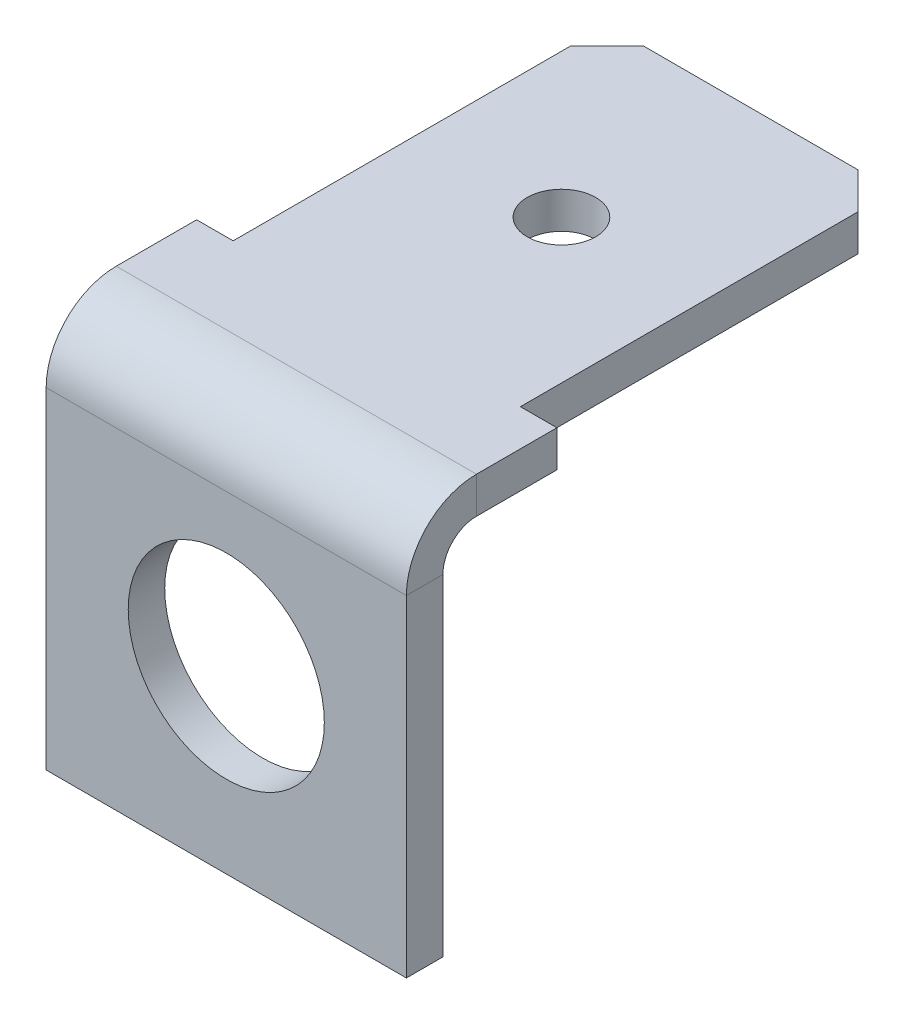
ISO-10303-21;
HEADER;
FILE_DESCRIPTION(('STEP AP214'),'2;1');
FILE_NAME('part.step','',(''),(''),'','','');
FILE_SCHEMA(('AUTOMOTIVE_DESIGN { 1 0 10303 214 1 1 1 1 }'));
ENDSEC;
DATA;
#1=APPLICATION_CONTEXT('core data for automotive mechanical design processes');
#2=APPLICATION_PROTOCOL_DEFINITION('international standard','automotive_design',2000,#1);
#3=PRODUCT_CONTEXT('',#1,'mechanical');
#4=PRODUCT('Part','Part','',(#3));
#5=PRODUCT_RELATED_PRODUCT_CATEGORY('part','',(#4));
#6=PRODUCT_DEFINITION_FORMATION('','',#4);
#7=PRODUCT_DEFINITION_CONTEXT('part definition',#1,'design');
#8=PRODUCT_DEFINITION('design','',#6,#7);
#9=PRODUCT_DEFINITION_SHAPE('','',#8);
#10=(LENGTH_UNIT() NAMED_UNIT(*) SI_UNIT(.MILLI.,.METRE.));
#11=(NAMED_UNIT(*) PLANE_ANGLE_UNIT() SI_UNIT($,.RADIAN.));
#12=(NAMED_UNIT(*) SI_UNIT($,.STERADIAN.) SOLID_ANGLE_UNIT());
#13=UNCERTAINTY_MEASURE_WITH_UNIT(LENGTH_MEASURE(1.E-05),#10,'distance_accuracy_value','');
#14=(GEOMETRIC_REPRESENTATION_CONTEXT(3) GLOBAL_UNCERTAINTY_ASSIGNED_CONTEXT((#13)) GLOBAL_UNIT_ASSIGNED_CONTEXT((#10,
#11,#12)) REPRESENTATION_CONTEXT('',''));
#15=CARTESIAN_POINT('',(0.,0.,0.));
#16=DIRECTION('',(0.,0.,1.));
#17=DIRECTION('',(1.,0.,0.));
#18=AXIS2_PLACEMENT_3D('',#15,#16,#17);
#19=CARTESIAN_POINT('',(3.95,4.4,-0.8));
#20=DIRECTION('',(1.,0.,0.));
#21=DIRECTION('',(0.,1.,0.));
#22=AXIS2_PLACEMENT_3D('',#19,#20,#21);
#23=PLANE('',#22);
#24=DIRECTION('',(0.,1.,0.));
#25=VECTOR('',#24,1.);
#26=CARTESIAN_POINT('',(3.95,4.4,-0.8));
#27=LINE('',#26,#25);
#28=CARTESIAN_POINT('',(3.95,-4.4,-0.8));
#29=VERTEX_POINT('',#28);
#30=CARTESIAN_POINT('',(3.95,2.8634,-0.8));
#31=VERTEX_POINT('',#30);
#32=EDGE_CURVE('E254',#29,#31,#27,.T.);
#33=ORIENTED_EDGE('',*,*,#32,.T.);
#34=DIRECTION('',(0.,0.,1.));
#35=VECTOR('',#34,1.);
#36=CARTESIAN_POINT('',(3.95,2.8634,-0.8));
#37=LINE('',#36,#35);
#38=CARTESIAN_POINT('',(3.95,2.8634,0.));
#39=VERTEX_POINT('',#38);
#40=EDGE_CURVE('E232',#31,#39,#37,.T.);
#41=ORIENTED_EDGE('',*,*,#40,.T.);
#42=DIRECTION('',(0.,1.,0.));
#43=VECTOR('',#42,1.);
#44=CARTESIAN_POINT('',(3.95,4.4,0.));
#45=LINE('',#44,#43);
#46=CARTESIAN_POINT('',(3.95,-4.4,0.));
#47=VERTEX_POINT('',#46);
#48=EDGE_CURVE('E251',#47,#39,#45,.T.);
#49=ORIENTED_EDGE('',*,*,#48,.F.);
#50=DIRECTION('',(0.,0.,1.));
#51=VECTOR('',#50,1.);
#52=CARTESIAN_POINT('',(3.95,-4.4,-0.8));
#53=LINE('',#52,#51);
#54=EDGE_CURVE('E264',#29,#47,#53,.T.);
#55=ORIENTED_EDGE('',*,*,#54,.F.);
#56=EDGE_LOOP('',(#33,#41,#49,#55));
#57=FACE_BOUND('',#56,.T.);
#58=ADVANCED_FACE('F57',(#57),#23,.T.);
#59=CARTESIAN_POINT('',(0.,0.,-0.8));
#60=DIRECTION('',(0.,0.,1.));
#61=DIRECTION('',(1.,0.,0.));
#62=AXIS2_PLACEMENT_3D('',#59,#60,#61);
#63=PLANE('',#62);
#64=CARTESIAN_POINT('',(0.,-0.45,-0.8));
#65=DIRECTION('',(0.,0.,-1.));
#66=DIRECTION('',(-1.,0.,0.));
#67=AXIS2_PLACEMENT_3D('',#64,#65,#66);
#68=CIRCLE('',#67,2.15);
#69=CARTESIAN_POINT('',(-2.15,-0.45,-0.8));
#70=VERTEX_POINT('',#69);
#71=EDGE_CURVE('E196',#70,#70,#68,.T.);
#72=ORIENTED_EDGE('',*,*,#71,.F.);
#73=EDGE_LOOP('',(#72));
#74=FACE_BOUND('',#73,.T.);
#75=DIRECTION('',(1.,0.,0.));
#76=VECTOR('',#75,1.);
#77=CARTESIAN_POINT('',(3.95,2.8634,-0.8));
#78=LINE('',#77,#76);
#79=CARTESIAN_POINT('',(-3.95,2.8634,-0.8));
#80=VERTEX_POINT('',#79);
#81=EDGE_CURVE('E238',#31,#80,#78,.F.);
#82=ORIENTED_EDGE('',*,*,#81,.F.);
#83=ORIENTED_EDGE('',*,*,#32,.F.);
#84=DIRECTION('',(1.,0.,0.));
#85=VECTOR('',#84,1.);
#86=CARTESIAN_POINT('',(-3.95,-4.4,-0.8));
#87=LINE('',#86,#85);
#88=CARTESIAN_POINT('',(-3.95,-4.4,-0.8));
#89=VERTEX_POINT('',#88);
#90=EDGE_CURVE('E250',#89,#29,#87,.T.);
#91=ORIENTED_EDGE('',*,*,#90,.F.);
#92=DIRECTION('',(0.,-1.,0.));
#93=VECTOR('',#92,1.);
#94=CARTESIAN_POINT('',(-3.95,4.4,-0.8));
#95=LINE('',#94,#93);
#96=EDGE_CURVE('E248',#80,#89,#95,.T.);
#97=ORIENTED_EDGE('',*,*,#96,.F.);
#98=EDGE_LOOP('',(#82,#83,#91,#97));
#99=FACE_BOUND('',#98,.T.);
#100=ADVANCED_FACE('F343',(#74,#99),#63,.F.);
#101=CARTESIAN_POINT('',(0.,0.,0.));
#102=DIRECTION('',(0.,0.,1.));
#103=DIRECTION('',(1.,0.,0.));
#104=AXIS2_PLACEMENT_3D('',#101,#102,#103);
#105=PLANE('',#104);
#106=CARTESIAN_POINT('',(0.,-0.45,0.));
#107=DIRECTION('',(0.,0.,1.));
#108=DIRECTION('',(1.,0.,0.));
#109=AXIS2_PLACEMENT_3D('',#106,#107,#108);
#110=CIRCLE('',#109,2.15);
#111=CARTESIAN_POINT('',(2.15,-0.45,0.));
#112=VERTEX_POINT('',#111);
#113=EDGE_CURVE('E199',#112,#112,#110,.T.);
#114=ORIENTED_EDGE('',*,*,#113,.F.);
#115=EDGE_LOOP('',(#114));
#116=FACE_BOUND('',#115,.T.);
#117=ORIENTED_EDGE('',*,*,#48,.T.);
#118=DIRECTION('',(1.,0.,0.));
#119=VECTOR('',#118,1.);
#120=CARTESIAN_POINT('',(3.95,2.8634,0.));
#121=LINE('',#120,#119);
#122=CARTESIAN_POINT('',(-3.95,2.8634,0.));
#123=VERTEX_POINT('',#122);
#124=EDGE_CURVE('E225',#39,#123,#121,.F.);
#125=ORIENTED_EDGE('',*,*,#124,.T.);
#126=DIRECTION('',(0.,-1.,0.));
#127=VECTOR('',#126,1.);
#128=CARTESIAN_POINT('',(-3.95,4.4,0.));
#129=LINE('',#128,#127);
#130=CARTESIAN_POINT('',(-3.95,-4.4,0.));
#131=VERTEX_POINT('',#130);
#132=EDGE_CURVE('E245',#123,#131,#129,.T.);
#133=ORIENTED_EDGE('',*,*,#132,.T.);
#134=DIRECTION('',(1.,0.,0.));
#135=VECTOR('',#134,1.);
#136=CARTESIAN_POINT('',(-3.95,-4.4,0.));
#137=LINE('',#136,#135);
#138=EDGE_CURVE('E259',#131,#47,#137,.T.);
#139=ORIENTED_EDGE('',*,*,#138,.T.);
#140=EDGE_LOOP('',(#117,#125,#133,#139));
#141=FACE_BOUND('',#140,.T.);
#142=ADVANCED_FACE('F325',(#116,#141),#105,.T.);
#143=CARTESIAN_POINT('',(-3.95,4.4,-0.8));
#144=DIRECTION('',(-1.,0.,0.));
#145=DIRECTION('',(0.,-1.,0.));
#146=AXIS2_PLACEMENT_3D('',#143,#144,#145);
#147=PLANE('',#146);
#148=DIRECTION('',(0.,0.,1.));
#149=VECTOR('',#148,1.);
#150=CARTESIAN_POINT('',(-3.95,2.8634,-0.8));
#151=LINE('',#150,#149);
#152=EDGE_CURVE('E242',#80,#123,#151,.T.);
#153=ORIENTED_EDGE('',*,*,#152,.F.);
#154=ORIENTED_EDGE('',*,*,#96,.T.);
#155=DIRECTION('',(0.,0.,1.));
#156=VECTOR('',#155,1.);
#157=CARTESIAN_POINT('',(-3.95,-4.4,-0.8));
#158=LINE('',#157,#156);
#159=EDGE_CURVE('E257',#89,#131,#158,.T.);
#160=ORIENTED_EDGE('',*,*,#159,.T.);
#161=ORIENTED_EDGE('',*,*,#132,.F.);
#162=EDGE_LOOP('',(#153,#154,#160,#161));
#163=FACE_BOUND('',#162,.T.);
#164=ADVANCED_FACE('F327',(#163),#147,.T.);
#165=CARTESIAN_POINT('',(-3.95,-4.4,-0.8));
#166=DIRECTION('',(0.,-1.,0.));
#167=DIRECTION('',(0.,0.,-1.));
#168=AXIS2_PLACEMENT_3D('',#165,#166,#167);
#169=PLANE('',#168);
#170=ORIENTED_EDGE('',*,*,#138,.F.);
#171=ORIENTED_EDGE('',*,*,#159,.F.);
#172=ORIENTED_EDGE('',*,*,#90,.T.);
#173=ORIENTED_EDGE('',*,*,#54,.T.);
#174=EDGE_LOOP('',(#170,#171,#172,#173));
#175=FACE_BOUND('',#174,.T.);
#176=ADVANCED_FACE('F332',(#175),#169,.T.);
#177=CARTESIAN_POINT('',(-3.95,2.8634,-1.5366));
#178=DIRECTION('',(-1.,0.,0.));
#179=DIRECTION('',(0.,0.,1.));
#180=AXIS2_PLACEMENT_3D('',#177,#178,#179);
#181=PLANE('',#180);
#182=DIRECTION('',(0.,-1.,0.));
#183=VECTOR('',#182,1.);
#184=CARTESIAN_POINT('',(-3.95,4.4,-1.5366));
#185=LINE('',#184,#183);
#186=CARTESIAN_POINT('',(-3.95,3.6,-1.5366));
#187=VERTEX_POINT('',#186);
#188=CARTESIAN_POINT('',(-3.95,4.4,-1.53659999999999));
#189=VERTEX_POINT('',#188);
#190=EDGE_CURVE('E222',#187,#189,#185,.F.);
#191=ORIENTED_EDGE('',*,*,#190,.F.);
#192=CARTESIAN_POINT('',(-3.95,2.8634,-1.5366));
#193=DIRECTION('',(1.,0.,0.));
#194=DIRECTION('',(0.,0.,-1.));
#195=AXIS2_PLACEMENT_3D('',#192,#193,#194);
#196=CIRCLE('',#195,0.7366);
#197=EDGE_CURVE('E235',#80,#187,#196,.F.);
#198=ORIENTED_EDGE('',*,*,#197,.F.);
#199=ORIENTED_EDGE('',*,*,#152,.T.);
#200=CARTESIAN_POINT('',(-3.95,2.8634,-1.5366));
#201=DIRECTION('',(1.,0.,0.));
#202=DIRECTION('',(0.,0.,-1.));
#203=AXIS2_PLACEMENT_3D('',#200,#201,#202);
#204=CIRCLE('',#203,1.5366);
#205=EDGE_CURVE('E228',#123,#189,#204,.F.);
#206=ORIENTED_EDGE('',*,*,#205,.T.);
#207=EDGE_LOOP('',(#191,#198,#199,#206));
#208=FACE_BOUND('',#207,.T.);
#209=ADVANCED_FACE('F318',(#208),#181,.T.);
#210=CARTESIAN_POINT('',(3.95,2.8634,-1.5366));
#211=DIRECTION('',(-1.,0.,0.));
#212=DIRECTION('',(0.,0.,1.));
#213=AXIS2_PLACEMENT_3D('',#210,#211,#212);
#214=PLANE('',#213);
#215=CARTESIAN_POINT('',(3.95,2.8634,-1.5366));
#216=DIRECTION('',(1.,0.,0.));
#217=DIRECTION('',(0.,0.,-1.));
#218=AXIS2_PLACEMENT_3D('',#215,#216,#217);
#219=CIRCLE('',#218,0.7366);
#220=CARTESIAN_POINT('',(3.95,3.6,-1.5366));
#221=VERTEX_POINT('',#220);
#222=EDGE_CURVE('E202',#221,#31,#219,.T.);
#223=ORIENTED_EDGE('',*,*,#222,.F.);
#224=DIRECTION('',(0.,-1.,0.));
#225=VECTOR('',#224,1.);
#226=CARTESIAN_POINT('',(3.95,3.6,-1.5366));
#227=LINE('',#226,#225);
#228=CARTESIAN_POINT('',(3.95,4.4,-1.53659999999999));
#229=VERTEX_POINT('',#228);
#230=EDGE_CURVE('E217',#221,#229,#227,.F.);
#231=ORIENTED_EDGE('',*,*,#230,.T.);
#232=CARTESIAN_POINT('',(3.95,2.8634,-1.5366));
#233=DIRECTION('',(1.,0.,0.));
#234=DIRECTION('',(0.,0.,-1.));
#235=AXIS2_PLACEMENT_3D('',#232,#233,#234);
#236=CIRCLE('',#235,1.5366);
#237=EDGE_CURVE('E229',#229,#39,#236,.T.);
#238=ORIENTED_EDGE('',*,*,#237,.T.);
#239=ORIENTED_EDGE('',*,*,#40,.F.);
#240=EDGE_LOOP('',(#223,#231,#238,#239));
#241=FACE_BOUND('',#240,.T.);
#242=ADVANCED_FACE('F337',(#241),#214,.F.);
#243=CARTESIAN_POINT('',(3.95,2.8634,-1.5366));
#244=DIRECTION('',(1.,0.,0.));
#245=DIRECTION('',(0.,1.,0.));
#246=AXIS2_PLACEMENT_3D('',#243,#244,#245);
#247=CYLINDRICAL_SURFACE('',#246,1.5366);
#248=ORIENTED_EDGE('',*,*,#124,.F.);
#249=ORIENTED_EDGE('',*,*,#237,.F.);
#250=DIRECTION('',(1.,0.,0.));
#251=VECTOR('',#250,1.);
#252=CARTESIAN_POINT('',(-3.95,4.4,-1.53659999999999));
#253=LINE('',#252,#251);
#254=EDGE_CURVE('E214',#229,#189,#253,.F.);
#255=ORIENTED_EDGE('',*,*,#254,.T.);
#256=ORIENTED_EDGE('',*,*,#205,.F.);
#257=EDGE_LOOP('',(#248,#249,#255,#256));
#258=FACE_BOUND('',#257,.T.);
#259=ADVANCED_FACE('F316',(#258),#247,.T.);
#260=CARTESIAN_POINT('',(3.95,2.8634,-1.5366));
#261=DIRECTION('',(1.,0.,0.));
#262=DIRECTION('',(0.,1.,0.));
#263=AXIS2_PLACEMENT_3D('',#260,#261,#262);
#264=CYLINDRICAL_SURFACE('',#263,0.7366);
#265=ORIENTED_EDGE('',*,*,#81,.T.);
#266=ORIENTED_EDGE('',*,*,#197,.T.);
#267=DIRECTION('',(1.,0.,0.));
#268=VECTOR('',#267,1.);
#269=CARTESIAN_POINT('',(-3.95,3.6,-1.5366));
#270=LINE('',#269,#268);
#271=EDGE_CURVE('E220',#187,#221,#270,.T.);
#272=ORIENTED_EDGE('',*,*,#271,.T.);
#273=ORIENTED_EDGE('',*,*,#222,.T.);
#274=EDGE_LOOP('',(#265,#266,#272,#273));
#275=FACE_BOUND('',#274,.T.);
#276=ADVANCED_FACE('F341',(#275),#264,.F.);
#277=CARTESIAN_POINT('',(3.95,4.40000000000004,-11.5));
#278=DIRECTION('',(-1.,0.,0.));
#279=DIRECTION('',(0.,0.,1.));
#280=AXIS2_PLACEMENT_3D('',#277,#278,#279);
#281=PLANE('',#280);
#282=DIRECTION('',(0.,0.,1.));
#283=VECTOR('',#282,1.);
#284=CARTESIAN_POINT('',(3.95,3.60000000000004,-11.5));
#285=LINE('',#284,#283);
#286=CARTESIAN_POINT('',(3.95,3.60000000000001,-3.3));
#287=VERTEX_POINT('',#286);
#288=EDGE_CURVE('E211',#221,#287,#285,.F.);
#289=ORIENTED_EDGE('',*,*,#288,.T.);
#290=DIRECTION('',(0.,1.,0.));
#291=VECTOR('',#290,1.);
#292=CARTESIAN_POINT('',(3.95,-5.59999999999999,-3.30000000000004));
#293=LINE('',#292,#291);
#294=CARTESIAN_POINT('',(3.95,4.40000000000001,-3.3));
#295=VERTEX_POINT('',#294);
#296=EDGE_CURVE('E172',#287,#295,#293,.T.);
#297=ORIENTED_EDGE('',*,*,#296,.T.);
#298=DIRECTION('',(0.,0.,-1.));
#299=VECTOR('',#298,1.);
#300=CARTESIAN_POINT('',(3.95,4.4,0.));
#301=LINE('',#300,#299);
#302=EDGE_CURVE('E178',#229,#295,#301,.T.);
#303=ORIENTED_EDGE('',*,*,#302,.F.);
#304=ORIENTED_EDGE('',*,*,#230,.F.);
#305=EDGE_LOOP('',(#289,#297,#303,#304));
#306=FACE_BOUND('',#305,.T.);
#307=ADVANCED_FACE('F393',(#306),#281,.F.);
#308=CARTESIAN_POINT('',(-3.95,4.4,-0.799999999999997));
#309=DIRECTION('',(1.,0.,0.));
#310=DIRECTION('',(0.,0.,-1.));
#311=AXIS2_PLACEMENT_3D('',#308,#309,#310);
#312=PLANE('',#311);
#313=DIRECTION('',(0.,0.,1.));
#314=VECTOR('',#313,1.);
#315=CARTESIAN_POINT('',(-3.95,4.4,0.));
#316=LINE('',#315,#314);
#317=CARTESIAN_POINT('',(-3.95,4.40000000000001,-3.3));
#318=VERTEX_POINT('',#317);
#319=EDGE_CURVE('E200',#318,#189,#316,.T.);
#320=ORIENTED_EDGE('',*,*,#319,.F.);
#321=DIRECTION('',(0.,1.,0.));
#322=VECTOR('',#321,1.);
#323=CARTESIAN_POINT('',(-3.95,-5.59999999999999,-3.30000000000004));
#324=LINE('',#323,#322);
#325=CARTESIAN_POINT('',(-3.95,3.60000000000001,-3.3));
#326=VERTEX_POINT('',#325);
#327=EDGE_CURVE('E190',#326,#318,#324,.T.);
#328=ORIENTED_EDGE('',*,*,#327,.F.);
#329=DIRECTION('',(0.,0.,-1.));
#330=VECTOR('',#329,1.);
#331=CARTESIAN_POINT('',(-3.95,3.6,-0.8));
#332=LINE('',#331,#330);
#333=EDGE_CURVE('E206',#326,#187,#332,.F.);
#334=ORIENTED_EDGE('',*,*,#333,.T.);
#335=ORIENTED_EDGE('',*,*,#190,.T.);
#336=EDGE_LOOP('',(#320,#328,#334,#335));
#337=FACE_BOUND('',#336,.T.);
#338=ADVANCED_FACE('F313',(#337),#312,.F.);
#339=CARTESIAN_POINT('',(0.,4.4,0.));
#340=DIRECTION('',(0.,-1.,0.));
#341=DIRECTION('',(0.,0.,-1.));
#342=AXIS2_PLACEMENT_3D('',#339,#340,#341);
#343=PLANE('',#342);
#344=CARTESIAN_POINT('',(0.,4.40000000000002,-7.35));
#345=DIRECTION('',(0.,1.,0.));
#346=DIRECTION('',(0.,0.,1.));
#347=AXIS2_PLACEMENT_3D('',#344,#345,#346);
#348=CIRCLE('',#347,0.75);
#349=CARTESIAN_POINT('',(0.,4.40000000000002,-6.6));
#350=VERTEX_POINT('',#349);
#351=EDGE_CURVE('E276',#350,#350,#348,.T.);
#352=ORIENTED_EDGE('',*,*,#351,.F.);
#353=EDGE_LOOP('',(#352));
#354=FACE_BOUND('',#353,.T.);
#355=DIRECTION('',(0.,0.,1.));
#356=VECTOR('',#355,1.);
#357=CARTESIAN_POINT('',(3.15,4.40000000000004,-11.5));
#358=LINE('',#357,#356);
#359=CARTESIAN_POINT('',(3.15,4.40000000000003,-10.7));
#360=VERTEX_POINT('',#359);
#361=CARTESIAN_POINT('',(3.15,4.40000000000001,-3.3));
#362=VERTEX_POINT('',#361);
#363=EDGE_CURVE('E157',#360,#362,#358,.T.);
#364=ORIENTED_EDGE('',*,*,#363,.F.);
#365=DIRECTION('',(0.707106781186545,0.,0.70710678118655));
#366=VECTOR('',#365,1.);
#367=CARTESIAN_POINT('',(2.35,4.40000000000004,-11.5));
#368=LINE('',#367,#366);
#369=CARTESIAN_POINT('',(2.35,4.40000000000004,-11.5));
#370=VERTEX_POINT('',#369);
#371=EDGE_CURVE('E65',#360,#370,#368,.F.);
#372=ORIENTED_EDGE('',*,*,#371,.T.);
#373=DIRECTION('',(-1.,0.,0.));
#374=VECTOR('',#373,1.);
#375=CARTESIAN_POINT('',(0.,4.40000000000004,-11.5));
#376=LINE('',#375,#374);
#377=CARTESIAN_POINT('',(-2.35,4.40000000000004,-11.5));
#378=VERTEX_POINT('',#377);
#379=EDGE_CURVE('E203',#370,#378,#376,.T.);
#380=ORIENTED_EDGE('',*,*,#379,.T.);
#381=DIRECTION('',(0.707106781186545,0.,-0.70710678118655));
#382=VECTOR('',#381,1.);
#383=CARTESIAN_POINT('',(-2.35,4.40000000000004,-11.5));
#384=LINE('',#383,#382);
#385=CARTESIAN_POINT('',(-3.15,4.40000000000003,-10.7));
#386=VERTEX_POINT('',#385);
#387=EDGE_CURVE('E72',#378,#386,#384,.F.);
#388=ORIENTED_EDGE('',*,*,#387,.T.);
#389=DIRECTION('',(0.,0.,-1.));
#390=VECTOR('',#389,1.);
#391=CARTESIAN_POINT('',(-3.15,4.40000000000004,-11.5));
#392=LINE('',#391,#390);
#393=CARTESIAN_POINT('',(-3.15,4.40000000000001,-3.3));
#394=VERTEX_POINT('',#393);
#395=EDGE_CURVE('E188',#394,#386,#392,.T.);
#396=ORIENTED_EDGE('',*,*,#395,.F.);
#397=DIRECTION('',(1.,0.,0.));
#398=VECTOR('',#397,1.);
#399=CARTESIAN_POINT('',(-3.95,4.40000000000001,-3.3));
#400=LINE('',#399,#398);
#401=EDGE_CURVE('E185',#318,#394,#400,.T.);
#402=ORIENTED_EDGE('',*,*,#401,.F.);
#403=ORIENTED_EDGE('',*,*,#319,.T.);
#404=ORIENTED_EDGE('',*,*,#254,.F.);
#405=ORIENTED_EDGE('',*,*,#302,.T.);
#406=DIRECTION('',(1.,0.,0.));
#407=VECTOR('',#406,1.);
#408=CARTESIAN_POINT('',(3.95,4.40000000000001,-3.3));
#409=LINE('',#408,#407);
#410=EDGE_CURVE('E164',#362,#295,#409,.T.);
#411=ORIENTED_EDGE('',*,*,#410,.F.);
#412=EDGE_LOOP('',(#364,#372,#380,#388,#396,#402,#403,#404,#405,#411));
#413=FACE_BOUND('',#412,.T.);
#414=ADVANCED_FACE('F175',(#354,#413),#343,.F.);
#415=CARTESIAN_POINT('',(0.,3.6,0.));
#416=DIRECTION('',(0.,-1.,0.));
#417=DIRECTION('',(0.,0.,-1.));
#418=AXIS2_PLACEMENT_3D('',#415,#416,#417);
#419=PLANE('',#418);
#420=CARTESIAN_POINT('',(0.,3.60000000000002,-7.35));
#421=DIRECTION('',(0.,-1.,0.));
#422=DIRECTION('',(0.,0.,-1.));
#423=AXIS2_PLACEMENT_3D('',#420,#421,#422);
#424=CIRCLE('',#423,0.75);
#425=CARTESIAN_POINT('',(0.,3.60000000000003,-8.1));
#426=VERTEX_POINT('',#425);
#427=EDGE_CURVE('E165',#426,#426,#424,.T.);
#428=ORIENTED_EDGE('',*,*,#427,.F.);
#429=EDGE_LOOP('',(#428));
#430=FACE_BOUND('',#429,.T.);
#431=DIRECTION('',(1.,0.,0.));
#432=VECTOR('',#431,1.);
#433=CARTESIAN_POINT('',(-3.95,3.60000000000004,-11.5));
#434=LINE('',#433,#432);
#435=CARTESIAN_POINT('',(2.35,3.60000000000004,-11.5));
#436=VERTEX_POINT('',#435);
#437=CARTESIAN_POINT('',(-2.35,3.60000000000004,-11.5));
#438=VERTEX_POINT('',#437);
#439=EDGE_CURVE('E208',#436,#438,#434,.F.);
#440=ORIENTED_EDGE('',*,*,#439,.F.);
#441=DIRECTION('',(-0.707106781186545,0.,-0.70710678118655));
#442=VECTOR('',#441,1.);
#443=CARTESIAN_POINT('',(6.92500000000002,3.60000000000002,-6.92499999999995));
#444=LINE('',#443,#442);
#445=CARTESIAN_POINT('',(3.15,3.60000000000004,-10.7));
#446=VERTEX_POINT('',#445);
#447=EDGE_CURVE('E284',#436,#446,#444,.F.);
#448=ORIENTED_EDGE('',*,*,#447,.T.);
#449=DIRECTION('',(0.,0.,-1.));
#450=VECTOR('',#449,1.);
#451=CARTESIAN_POINT('',(3.15,3.6,0.));
#452=LINE('',#451,#450);
#453=CARTESIAN_POINT('',(3.15,3.60000000000002,-3.3));
#454=VERTEX_POINT('',#453);
#455=EDGE_CURVE('E182',#454,#446,#452,.T.);
#456=ORIENTED_EDGE('',*,*,#455,.F.);
#457=DIRECTION('',(-1.,0.,0.));
#458=VECTOR('',#457,1.);
#459=CARTESIAN_POINT('',(0.,3.60000000000001,-3.3));
#460=LINE('',#459,#458);
#461=EDGE_CURVE('E171',#287,#454,#460,.T.);
#462=ORIENTED_EDGE('',*,*,#461,.F.);
#463=ORIENTED_EDGE('',*,*,#288,.F.);
#464=ORIENTED_EDGE('',*,*,#271,.F.);
#465=ORIENTED_EDGE('',*,*,#333,.F.);
#466=DIRECTION('',(-1.,0.,0.));
#467=VECTOR('',#466,1.);
#468=CARTESIAN_POINT('',(0.,3.60000000000001,-3.3));
#469=LINE('',#468,#467);
#470=CARTESIAN_POINT('',(-3.15,3.60000000000001,-3.3));
#471=VERTEX_POINT('',#470);
#472=EDGE_CURVE('E266',#471,#326,#469,.T.);
#473=ORIENTED_EDGE('',*,*,#472,.F.);
#474=DIRECTION('',(0.,0.,1.));
#475=VECTOR('',#474,1.);
#476=CARTESIAN_POINT('',(-3.15,3.6,0.));
#477=LINE('',#476,#475);
#478=CARTESIAN_POINT('',(-3.15,3.60000000000004,-10.7));
#479=VERTEX_POINT('',#478);
#480=EDGE_CURVE('E193',#479,#471,#477,.T.);
#481=ORIENTED_EDGE('',*,*,#480,.F.);
#482=DIRECTION('',(-0.707106781186545,0.,0.70710678118655));
#483=VECTOR('',#482,1.);
#484=CARTESIAN_POINT('',(-6.92500000000002,3.60000000000002,-6.92499999999995));
#485=LINE('',#484,#483);
#486=EDGE_CURVE('E282',#479,#438,#485,.F.);
#487=ORIENTED_EDGE('',*,*,#486,.T.);
#488=EDGE_LOOP('',(#440,#448,#456,#462,#463,#464,#465,#473,#481,#487));
#489=FACE_BOUND('',#488,.T.);
#490=ADVANCED_FACE('F296',(#430,#489),#419,.T.);
#491=CARTESIAN_POINT('',(-3.95,4.40000000000004,-11.5));
#492=DIRECTION('',(0.,0.,1.));
#493=DIRECTION('',(0.,-1.,0.));
#494=AXIS2_PLACEMENT_3D('',#491,#492,#493);
#495=PLANE('',#494);
#496=ORIENTED_EDGE('',*,*,#379,.F.);
#497=DIRECTION('',(0.,-1.,0.));
#498=VECTOR('',#497,1.);
#499=CARTESIAN_POINT('',(2.35,4.40000000000004,-11.5));
#500=LINE('',#499,#498);
#501=EDGE_CURVE('E279',#370,#436,#500,.T.);
#502=ORIENTED_EDGE('',*,*,#501,.T.);
#503=ORIENTED_EDGE('',*,*,#439,.T.);
#504=DIRECTION('',(0.,1.,0.));
#505=VECTOR('',#504,1.);
#506=CARTESIAN_POINT('',(-2.35,4.40000000000004,-11.5));
#507=LINE('',#506,#505);
#508=EDGE_CURVE('E273',#438,#378,#507,.T.);
#509=ORIENTED_EDGE('',*,*,#508,.T.);
#510=EDGE_LOOP('',(#496,#502,#503,#509));
#511=FACE_BOUND('',#510,.T.);
#512=ADVANCED_FACE('F291',(#511),#495,.F.);
#513=CARTESIAN_POINT('',(0.,-0.45,9.2));
#514=DIRECTION('',(0.,0.,-1.));
#515=DIRECTION('',(-1.,0.,0.));
#516=AXIS2_PLACEMENT_3D('',#513,#514,#515);
#517=CYLINDRICAL_SURFACE('',#516,2.15);
#518=ORIENTED_EDGE('',*,*,#113,.T.);
#519=EDGE_LOOP('',(#518));
#520=FACE_BOUND('',#519,.T.);
#521=ORIENTED_EDGE('',*,*,#71,.T.);
#522=EDGE_LOOP('',(#521));
#523=FACE_BOUND('',#522,.T.);
#524=ADVANCED_FACE('F379',(#520,#523),#517,.F.);
#525=CARTESIAN_POINT('',(-3.15,-5.59999999999996,-11.5));
#526=DIRECTION('',(1.,0.,0.));
#527=DIRECTION('',(0.,0.,-1.));
#528=AXIS2_PLACEMENT_3D('',#525,#526,#527);
#529=PLANE('',#528);
#530=ORIENTED_EDGE('',*,*,#395,.T.);
#531=DIRECTION('',(0.,-1.,0.));
#532=VECTOR('',#531,1.);
#533=CARTESIAN_POINT('',(-3.15,-5.59999999999997,-10.7));
#534=LINE('',#533,#532);
#535=EDGE_CURVE('E13',#386,#479,#534,.T.);
#536=ORIENTED_EDGE('',*,*,#535,.T.);
#537=ORIENTED_EDGE('',*,*,#480,.T.);
#538=DIRECTION('',(0.,1.,0.));
#539=VECTOR('',#538,1.);
#540=CARTESIAN_POINT('',(-3.15,-5.59999999999999,-3.30000000000004));
#541=LINE('',#540,#539);
#542=EDGE_CURVE('E191',#471,#394,#541,.T.);
#543=ORIENTED_EDGE('',*,*,#542,.T.);
#544=EDGE_LOOP('',(#530,#536,#537,#543));
#545=FACE_BOUND('',#544,.T.);
#546=ADVANCED_FACE('F302',(#545),#529,.F.);
#547=CARTESIAN_POINT('',(-3.95,-5.59999999999999,-3.30000000000004));
#548=DIRECTION('',(0.,0.,1.));
#549=DIRECTION('',(0.,-1.,0.));
#550=AXIS2_PLACEMENT_3D('',#547,#548,#549);
#551=PLANE('',#550);
#552=ORIENTED_EDGE('',*,*,#472,.T.);
#553=ORIENTED_EDGE('',*,*,#327,.T.);
#554=ORIENTED_EDGE('',*,*,#401,.T.);
#555=ORIENTED_EDGE('',*,*,#542,.F.);
#556=EDGE_LOOP('',(#552,#553,#554,#555));
#557=FACE_BOUND('',#556,.T.);
#558=ADVANCED_FACE('F309',(#557),#551,.F.);
#559=CARTESIAN_POINT('',(3.95,-5.59999999999999,-3.30000000000004));
#560=DIRECTION('',(0.,0.,1.));
#561=DIRECTION('',(0.,-1.,0.));
#562=AXIS2_PLACEMENT_3D('',#559,#560,#561);
#563=PLANE('',#562);
#564=ORIENTED_EDGE('',*,*,#461,.T.);
#565=DIRECTION('',(0.,1.,0.));
#566=VECTOR('',#565,1.);
#567=CARTESIAN_POINT('',(3.15,-5.59999999999999,-3.30000000000004));
#568=LINE('',#567,#566);
#569=EDGE_CURVE('E160',#454,#362,#568,.T.);
#570=ORIENTED_EDGE('',*,*,#569,.T.);
#571=ORIENTED_EDGE('',*,*,#410,.T.);
#572=ORIENTED_EDGE('',*,*,#296,.F.);
#573=EDGE_LOOP('',(#564,#570,#571,#572));
#574=FACE_BOUND('',#573,.T.);
#575=ADVANCED_FACE('F168',(#574),#563,.F.);
#576=CARTESIAN_POINT('',(3.15,-5.59999999999996,-11.5));
#577=DIRECTION('',(-1.,0.,0.));
#578=DIRECTION('',(0.,0.,1.));
#579=AXIS2_PLACEMENT_3D('',#576,#577,#578);
#580=PLANE('',#579);
#581=ORIENTED_EDGE('',*,*,#455,.T.);
#582=DIRECTION('',(0.,1.,0.));
#583=VECTOR('',#582,1.);
#584=CARTESIAN_POINT('',(3.15,-5.59999999999997,-10.7));
#585=LINE('',#584,#583);
#586=EDGE_CURVE('E80',#446,#360,#585,.T.);
#587=ORIENTED_EDGE('',*,*,#586,.T.);
#588=ORIENTED_EDGE('',*,*,#363,.T.);
#589=ORIENTED_EDGE('',*,*,#569,.F.);
#590=EDGE_LOOP('',(#581,#587,#588,#589));
#591=FACE_BOUND('',#590,.T.);
#592=ADVANCED_FACE('F159',(#591),#580,.F.);
#593=CARTESIAN_POINT('',(0.,-5.59999999999998,-7.35000000000003));
#594=DIRECTION('',(0.,1.,0.));
#595=DIRECTION('',(0.,0.,1.));
#596=AXIS2_PLACEMENT_3D('',#593,#594,#595);
#597=CYLINDRICAL_SURFACE('',#596,0.75);
#598=ORIENTED_EDGE('',*,*,#427,.T.);
#599=EDGE_LOOP('',(#598));
#600=FACE_BOUND('',#599,.T.);
#601=ORIENTED_EDGE('',*,*,#351,.T.);
#602=EDGE_LOOP('',(#601));
#603=FACE_BOUND('',#602,.T.);
#604=ADVANCED_FACE('F362',(#600,#603),#597,.F.);
#605=CARTESIAN_POINT('',(2.35,4.40000000000004,-11.5));
#606=DIRECTION('',(-0.70710678118655,0.,0.707106781186545));
#607=DIRECTION('',(0.,-1.,0.));
#608=AXIS2_PLACEMENT_3D('',#605,#606,#607);
#609=PLANE('',#608);
#610=ORIENTED_EDGE('',*,*,#371,.F.);
#611=ORIENTED_EDGE('',*,*,#586,.F.);
#612=ORIENTED_EDGE('',*,*,#447,.F.);
#613=ORIENTED_EDGE('',*,*,#501,.F.);
#614=EDGE_LOOP('',(#610,#611,#612,#613));
#615=FACE_BOUND('',#614,.T.);
#616=ADVANCED_FACE('F294',(#615),#609,.F.);
#617=CARTESIAN_POINT('',(-2.35,4.40000000000004,-11.5));
#618=DIRECTION('',(0.70710678118655,0.,0.707106781186545));
#619=DIRECTION('',(0.,1.,0.));
#620=AXIS2_PLACEMENT_3D('',#617,#618,#619);
#621=PLANE('',#620);
#622=ORIENTED_EDGE('',*,*,#486,.F.);
#623=ORIENTED_EDGE('',*,*,#535,.F.);
#624=ORIENTED_EDGE('',*,*,#387,.F.);
#625=ORIENTED_EDGE('',*,*,#508,.F.);
#626=EDGE_LOOP('',(#622,#623,#624,#625));
#627=FACE_BOUND('',#626,.T.);
#628=ADVANCED_FACE('F59',(#627),#621,.F.);
#629=CLOSED_SHELL('',(#58,#100,#142,#164,#176,#209,#242,#259,#276,#307,#338,#414,#490,#512,#524,
#546,#558,#575,#592,#604,#616,#628));
#630=MANIFOLD_SOLID_BREP('B2',#629);
#631=ADVANCED_BREP_SHAPE_REPRESENTATION('',(#18,#630),#14);
#632=SHAPE_DEFINITION_REPRESENTATION(#9,#631);
ENDSEC;
END-ISO-10303-21;
